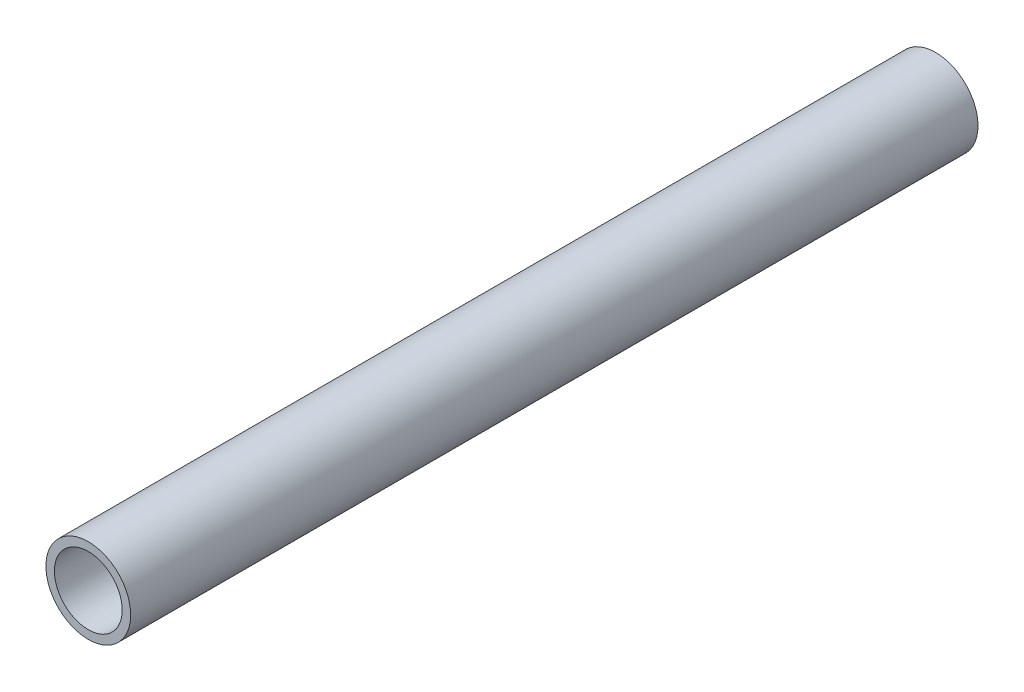
ISO-10303-21;
HEADER;
FILE_DESCRIPTION(('STEP AP214'),'2;1');
FILE_NAME('part.step','',(''),(''),'','','');
FILE_SCHEMA(('AUTOMOTIVE_DESIGN { 1 0 10303 214 1 1 1 1 }'));
ENDSEC;
DATA;
#1=APPLICATION_CONTEXT('core data for automotive mechanical design processes');
#2=APPLICATION_PROTOCOL_DEFINITION('international standard','automotive_design',2000,#1);
#3=PRODUCT_CONTEXT('',#1,'mechanical');
#4=PRODUCT('Part','Part','',(#3));
#5=PRODUCT_RELATED_PRODUCT_CATEGORY('part','',(#4));
#6=PRODUCT_DEFINITION_FORMATION('','',#4);
#7=PRODUCT_DEFINITION_CONTEXT('part definition',#1,'design');
#8=PRODUCT_DEFINITION('design','',#6,#7);
#9=PRODUCT_DEFINITION_SHAPE('','',#8);
#10=(LENGTH_UNIT() NAMED_UNIT(*) SI_UNIT(.MILLI.,.METRE.));
#11=(NAMED_UNIT(*) PLANE_ANGLE_UNIT() SI_UNIT($,.RADIAN.));
#12=(NAMED_UNIT(*) SI_UNIT($,.STERADIAN.) SOLID_ANGLE_UNIT());
#13=UNCERTAINTY_MEASURE_WITH_UNIT(LENGTH_MEASURE(1.E-05),#10,'distance_accuracy_value','');
#14=(GEOMETRIC_REPRESENTATION_CONTEXT(3) GLOBAL_UNCERTAINTY_ASSIGNED_CONTEXT((#13)) GLOBAL_UNIT_ASSIGNED_CONTEXT((#10,
#11,#12)) REPRESENTATION_CONTEXT('',''));
#15=CARTESIAN_POINT('',(0.,0.,0.));
#16=DIRECTION('',(0.,0.,1.));
#17=DIRECTION('',(1.,0.,0.));
#18=AXIS2_PLACEMENT_3D('',#15,#16,#17);
#19=CARTESIAN_POINT('',(0.,0.,100.));
#20=DIRECTION('',(0.,0.,1.));
#21=DIRECTION('',(1.,0.,0.));
#22=AXIS2_PLACEMENT_3D('',#19,#20,#21);
#23=PLANE('',#22);
#24=CARTESIAN_POINT('',(0.,0.,100.));
#25=DIRECTION('',(0.,0.,1.));
#26=DIRECTION('',(1.,0.,0.));
#27=AXIS2_PLACEMENT_3D('',#24,#25,#26);
#28=CIRCLE('',#27,5.);
#29=CARTESIAN_POINT('',(5.,0.,100.));
#30=VERTEX_POINT('',#29);
#31=EDGE_CURVE('E10',#30,#30,#28,.T.);
#32=ORIENTED_EDGE('',*,*,#31,.T.);
#33=EDGE_LOOP('',(#32));
#34=FACE_BOUND('',#33,.T.);
#35=CARTESIAN_POINT('',(0.,0.,100.));
#36=DIRECTION('',(0.,0.,1.));
#37=DIRECTION('',(1.,0.,0.));
#38=AXIS2_PLACEMENT_3D('',#35,#36,#37);
#39=CIRCLE('',#38,4.);
#40=CARTESIAN_POINT('',(4.,0.,100.));
#41=VERTEX_POINT('',#40);
#42=EDGE_CURVE('E56',#41,#41,#39,.T.);
#43=ORIENTED_EDGE('',*,*,#42,.F.);
#44=EDGE_LOOP('',(#43));
#45=FACE_BOUND('',#44,.T.);
#46=ADVANCED_FACE('F43',(#34,#45),#23,.T.);
#47=CARTESIAN_POINT('',(0.,0.,0.));
#48=DIRECTION('',(0.,0.,1.));
#49=DIRECTION('',(1.,0.,0.));
#50=AXIS2_PLACEMENT_3D('',#47,#48,#49);
#51=PLANE('',#50);
#52=CARTESIAN_POINT('',(0.,0.,0.));
#53=DIRECTION('',(0.,0.,1.));
#54=DIRECTION('',(1.,0.,0.));
#55=AXIS2_PLACEMENT_3D('',#52,#53,#54);
#56=CIRCLE('',#55,5.);
#57=CARTESIAN_POINT('',(5.,0.,0.));
#58=VERTEX_POINT('',#57);
#59=EDGE_CURVE('E47',#58,#58,#56,.T.);
#60=ORIENTED_EDGE('',*,*,#59,.F.);
#61=EDGE_LOOP('',(#60));
#62=FACE_BOUND('',#61,.T.);
#63=CARTESIAN_POINT('',(0.,0.,0.));
#64=DIRECTION('',(0.,0.,1.));
#65=DIRECTION('',(1.,0.,0.));
#66=AXIS2_PLACEMENT_3D('',#63,#64,#65);
#67=CIRCLE('',#66,4.);
#68=CARTESIAN_POINT('',(4.,0.,0.));
#69=VERTEX_POINT('',#68);
#70=EDGE_CURVE('E58',#69,#69,#67,.T.);
#71=ORIENTED_EDGE('',*,*,#70,.T.);
#72=EDGE_LOOP('',(#71));
#73=FACE_BOUND('',#72,.T.);
#74=ADVANCED_FACE('F70',(#62,#73),#51,.F.);
#75=CARTESIAN_POINT('',(0.,0.,100.));
#76=DIRECTION('',(0.,0.,-1.));
#77=DIRECTION('',(-1.,0.,0.));
#78=AXIS2_PLACEMENT_3D('',#75,#76,#77);
#79=CYLINDRICAL_SURFACE('',#78,5.);
#80=ORIENTED_EDGE('',*,*,#31,.F.);
#81=EDGE_LOOP('',(#80));
#82=FACE_BOUND('',#81,.T.);
#83=ORIENTED_EDGE('',*,*,#59,.T.);
#84=EDGE_LOOP('',(#83));
#85=FACE_BOUND('',#84,.T.);
#86=ADVANCED_FACE('F45',(#82,#85),#79,.T.);
#87=CARTESIAN_POINT('',(0.,0.,100.));
#88=DIRECTION('',(0.,0.,-1.));
#89=DIRECTION('',(-1.,0.,0.));
#90=AXIS2_PLACEMENT_3D('',#87,#88,#89);
#91=CYLINDRICAL_SURFACE('',#90,4.);
#92=ORIENTED_EDGE('',*,*,#42,.T.);
#93=EDGE_LOOP('',(#92));
#94=FACE_BOUND('',#93,.T.);
#95=ORIENTED_EDGE('',*,*,#70,.F.);
#96=EDGE_LOOP('',(#95));
#97=FACE_BOUND('',#96,.T.);
#98=ADVANCED_FACE('F66',(#94,#97),#91,.F.);
#99=CLOSED_SHELL('',(#46,#74,#86,#98));
#100=MANIFOLD_SOLID_BREP('B2',#99);
#101=ADVANCED_BREP_SHAPE_REPRESENTATION('',(#18,#100),#14);
#102=SHAPE_DEFINITION_REPRESENTATION(#9,#101);
ENDSEC;
END-ISO-10303-21;
